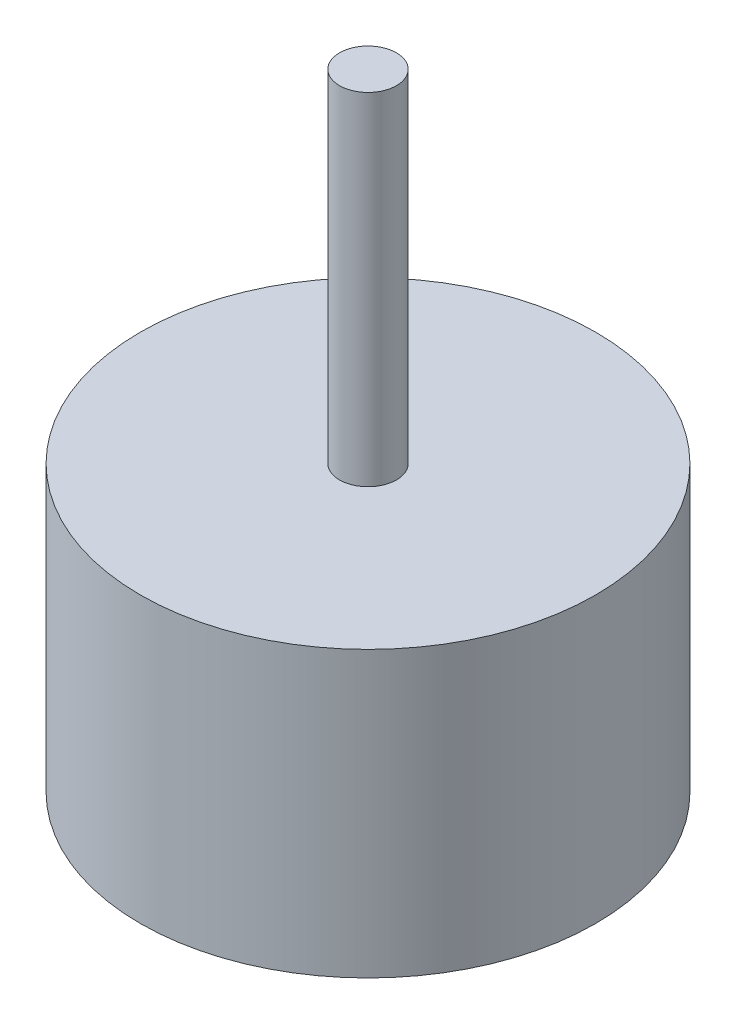
ISO-10303-21;
HEADER;
FILE_DESCRIPTION(('STEP AP214'),'2;1');
FILE_NAME('part.step','',(''),(''),'','','');
FILE_SCHEMA(('AUTOMOTIVE_DESIGN { 1 0 10303 214 1 1 1 1 }'));
ENDSEC;
DATA;
#1=APPLICATION_CONTEXT('core data for automotive mechanical design processes');
#2=APPLICATION_PROTOCOL_DEFINITION('international standard','automotive_design',2000,#1);
#3=PRODUCT_CONTEXT('',#1,'mechanical');
#4=PRODUCT('Part','Part','',(#3));
#5=PRODUCT_RELATED_PRODUCT_CATEGORY('part','',(#4));
#6=PRODUCT_DEFINITION_FORMATION('','',#4);
#7=PRODUCT_DEFINITION_CONTEXT('part definition',#1,'design');
#8=PRODUCT_DEFINITION('design','',#6,#7);
#9=PRODUCT_DEFINITION_SHAPE('','',#8);
#10=(LENGTH_UNIT() NAMED_UNIT(*) SI_UNIT(.MILLI.,.METRE.));
#11=(NAMED_UNIT(*) PLANE_ANGLE_UNIT() SI_UNIT($,.RADIAN.));
#12=(NAMED_UNIT(*) SI_UNIT($,.STERADIAN.) SOLID_ANGLE_UNIT());
#13=UNCERTAINTY_MEASURE_WITH_UNIT(LENGTH_MEASURE(1.E-05),#10,'distance_accuracy_value','');
#14=(GEOMETRIC_REPRESENTATION_CONTEXT(3) GLOBAL_UNCERTAINTY_ASSIGNED_CONTEXT((#13)) GLOBAL_UNIT_ASSIGNED_CONTEXT((#10,
#11,#12)) REPRESENTATION_CONTEXT('',''));
#15=CARTESIAN_POINT('',(0.,0.,0.));
#16=DIRECTION('',(0.,0.,1.));
#17=DIRECTION('',(1.,0.,0.));
#18=AXIS2_PLACEMENT_3D('',#15,#16,#17);
#19=CARTESIAN_POINT('',(0.,25.,0.));
#20=DIRECTION('',(0.,-1.,0.));
#21=DIRECTION('',(0.,0.,-1.));
#22=AXIS2_PLACEMENT_3D('',#19,#20,#21);
#23=CYLINDRICAL_SURFACE('',#22,20.);
#24=CARTESIAN_POINT('',(0.,25.,0.));
#25=DIRECTION('',(0.,1.,0.));
#26=DIRECTION('',(0.,0.,1.));
#27=AXIS2_PLACEMENT_3D('',#24,#25,#26);
#28=CIRCLE('',#27,20.);
#29=CARTESIAN_POINT('',(0.,25.,20.));
#30=VERTEX_POINT('',#29);
#31=EDGE_CURVE('E10',#30,#30,#28,.T.);
#32=ORIENTED_EDGE('',*,*,#31,.F.);
#33=EDGE_LOOP('',(#32));
#34=FACE_BOUND('',#33,.T.);
#35=CARTESIAN_POINT('',(0.,0.,0.));
#36=DIRECTION('',(0.,1.,0.));
#37=DIRECTION('',(0.,0.,1.));
#38=AXIS2_PLACEMENT_3D('',#35,#36,#37);
#39=CIRCLE('',#38,20.);
#40=CARTESIAN_POINT('',(0.,0.,20.));
#41=VERTEX_POINT('',#40);
#42=EDGE_CURVE('E34',#41,#41,#39,.T.);
#43=ORIENTED_EDGE('',*,*,#42,.T.);
#44=EDGE_LOOP('',(#43));
#45=FACE_BOUND('',#44,.T.);
#46=ADVANCED_FACE('F31',(#34,#45),#23,.T.);
#47=CARTESIAN_POINT('',(0.,25.,0.));
#48=DIRECTION('',(0.,1.,0.));
#49=DIRECTION('',(0.,0.,1.));
#50=AXIS2_PLACEMENT_3D('',#47,#48,#49);
#51=PLANE('',#50);
#52=CARTESIAN_POINT('',(0.,25.,0.));
#53=DIRECTION('',(0.,1.,0.));
#54=DIRECTION('',(0.,0.,1.));
#55=AXIS2_PLACEMENT_3D('',#52,#53,#54);
#56=CIRCLE('',#55,2.5);
#57=CARTESIAN_POINT('',(0.,25.,2.5));
#58=VERTEX_POINT('',#57);
#59=EDGE_CURVE('E43',#58,#58,#56,.T.);
#60=ORIENTED_EDGE('',*,*,#59,.F.);
#61=EDGE_LOOP('',(#60));
#62=FACE_BOUND('',#61,.T.);
#63=ORIENTED_EDGE('',*,*,#31,.T.);
#64=EDGE_LOOP('',(#63));
#65=FACE_BOUND('',#64,.T.);
#66=ADVANCED_FACE('F58',(#62,#65),#51,.T.);
#67=CARTESIAN_POINT('',(0.,0.,0.));
#68=DIRECTION('',(0.,1.,0.));
#69=DIRECTION('',(0.,0.,1.));
#70=AXIS2_PLACEMENT_3D('',#67,#68,#69);
#71=PLANE('',#70);
#72=ORIENTED_EDGE('',*,*,#42,.F.);
#73=EDGE_LOOP('',(#72));
#74=FACE_BOUND('',#73,.T.);
#75=ADVANCED_FACE('F54',(#74),#71,.F.);
#76=CARTESIAN_POINT('',(0.,55.,0.));
#77=DIRECTION('',(0.,-1.,0.));
#78=DIRECTION('',(0.,0.,-1.));
#79=AXIS2_PLACEMENT_3D('',#76,#77,#78);
#80=CYLINDRICAL_SURFACE('',#79,2.5);
#81=CARTESIAN_POINT('',(0.,55.,0.));
#82=DIRECTION('',(0.,1.,0.));
#83=DIRECTION('',(0.,0.,1.));
#84=AXIS2_PLACEMENT_3D('',#81,#82,#83);
#85=CIRCLE('',#84,2.5);
#86=CARTESIAN_POINT('',(0.,55.,2.5));
#87=VERTEX_POINT('',#86);
#88=EDGE_CURVE('E41',#87,#87,#85,.T.);
#89=ORIENTED_EDGE('',*,*,#88,.F.);
#90=EDGE_LOOP('',(#89));
#91=FACE_BOUND('',#90,.T.);
#92=ORIENTED_EDGE('',*,*,#59,.T.);
#93=EDGE_LOOP('',(#92));
#94=FACE_BOUND('',#93,.T.);
#95=ADVANCED_FACE('F51',(#91,#94),#80,.T.);
#96=CARTESIAN_POINT('',(0.,55.,0.));
#97=DIRECTION('',(0.,1.,0.));
#98=DIRECTION('',(0.,0.,1.));
#99=AXIS2_PLACEMENT_3D('',#96,#97,#98);
#100=PLANE('',#99);
#101=ORIENTED_EDGE('',*,*,#88,.T.);
#102=EDGE_LOOP('',(#101));
#103=FACE_BOUND('',#102,.T.);
#104=ADVANCED_FACE('F49',(#103),#100,.T.);
#105=CLOSED_SHELL('',(#46,#66,#75,#95,#104));
#106=MANIFOLD_SOLID_BREP('B2',#105);
#107=ADVANCED_BREP_SHAPE_REPRESENTATION('',(#18,#106),#14);
#108=SHAPE_DEFINITION_REPRESENTATION(#9,#107);
ENDSEC;
END-ISO-10303-21;
